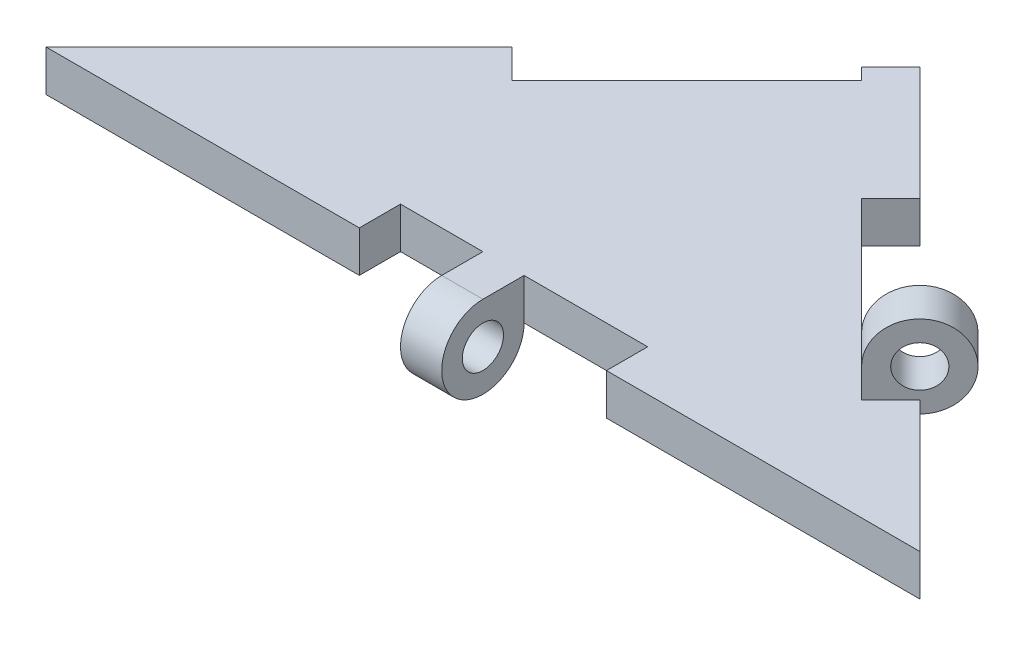
ISO-10303-21;
HEADER;
FILE_DESCRIPTION(('STEP AP214'),'2;1');
FILE_NAME('part.step','',(''),(''),'','','');
FILE_SCHEMA(('AUTOMOTIVE_DESIGN { 1 0 10303 214 1 1 1 1 }'));
ENDSEC;
DATA;
#1=APPLICATION_CONTEXT('core data for automotive mechanical design processes');
#2=APPLICATION_PROTOCOL_DEFINITION('international standard','automotive_design',2000,#1);
#3=PRODUCT_CONTEXT('',#1,'mechanical');
#4=PRODUCT('Part','Part','',(#3));
#5=PRODUCT_RELATED_PRODUCT_CATEGORY('part','',(#4));
#6=PRODUCT_DEFINITION_FORMATION('','',#4);
#7=PRODUCT_DEFINITION_CONTEXT('part definition',#1,'design');
#8=PRODUCT_DEFINITION('design','',#6,#7);
#9=PRODUCT_DEFINITION_SHAPE('','',#8);
#10=(LENGTH_UNIT() NAMED_UNIT(*) SI_UNIT(.MILLI.,.METRE.));
#11=(NAMED_UNIT(*) PLANE_ANGLE_UNIT() SI_UNIT($,.RADIAN.));
#12=(NAMED_UNIT(*) SI_UNIT($,.STERADIAN.) SOLID_ANGLE_UNIT());
#13=UNCERTAINTY_MEASURE_WITH_UNIT(LENGTH_MEASURE(1.E-05),#10,'distance_accuracy_value','');
#14=(GEOMETRIC_REPRESENTATION_CONTEXT(3) GLOBAL_UNCERTAINTY_ASSIGNED_CONTEXT((#13)) GLOBAL_UNIT_ASSIGNED_CONTEXT((#10,
#11,#12)) REPRESENTATION_CONTEXT('',''));
#15=CARTESIAN_POINT('',(0.,0.,0.));
#16=DIRECTION('',(0.,0.,1.));
#17=DIRECTION('',(1.,0.,0.));
#18=AXIS2_PLACEMENT_3D('',#15,#16,#17);
#19=CARTESIAN_POINT('',(12.3743686707646,5.,-33.587572106361));
#20=DIRECTION('',(-0.707106781186548,0.,0.707106781186547));
#21=DIRECTION('',(0.707106781186547,0.,0.707106781186548));
#22=AXIS2_PLACEMENT_3D('',#19,#20,#21);
#23=PLANE('',#22);
#24=DIRECTION('',(0.,1.,0.));
#25=VECTOR('',#24,1.);
#26=CARTESIAN_POINT('',(30.0520382004283,0.,-15.9099025766973));
#27=LINE('',#26,#25);
#28=CARTESIAN_POINT('',(30.0520382004283,0.,-15.9099025766973));
#29=VERTEX_POINT('',#28);
#30=CARTESIAN_POINT('',(30.0520382004283,5.,-15.9099025766973));
#31=VERTEX_POINT('',#30);
#32=EDGE_CURVE('E333',#29,#31,#27,.T.);
#33=ORIENTED_EDGE('',*,*,#32,.T.);
#34=DIRECTION('',(-0.707106781186547,0.,-0.707106781186548));
#35=VECTOR('',#34,1.);
#36=CARTESIAN_POINT('',(12.3743686707646,5.,-33.587572106361));
#37=LINE('',#36,#35);
#38=CARTESIAN_POINT('',(33.587572106361,5.,-12.3743686707646));
#39=VERTEX_POINT('',#38);
#40=EDGE_CURVE('E292',#39,#31,#37,.T.);
#41=ORIENTED_EDGE('',*,*,#40,.F.);
#42=DIRECTION('',(0.,-1.,0.));
#43=VECTOR('',#42,1.);
#44=CARTESIAN_POINT('',(33.587572106361,5.,-12.3743686707646));
#45=LINE('',#44,#43);
#46=CARTESIAN_POINT('',(33.587572106361,0.,-12.3743686707646));
#47=VERTEX_POINT('',#46);
#48=EDGE_CURVE('E287',#39,#47,#45,.T.);
#49=ORIENTED_EDGE('',*,*,#48,.T.);
#50=DIRECTION('',(-0.707106781186547,0.,-0.707106781186548));
#51=VECTOR('',#50,1.);
#52=CARTESIAN_POINT('',(12.3743686707646,0.,-33.587572106361));
#53=LINE('',#52,#51);
#54=EDGE_CURVE('E386',#47,#29,#53,.T.);
#55=ORIENTED_EDGE('',*,*,#54,.T.);
#56=EDGE_LOOP('',(#33,#41,#49,#55));
#57=FACE_BOUND('',#56,.T.);
#58=ADVANCED_FACE('F36',(#57),#23,.F.);
#59=CARTESIAN_POINT('',(-15.,0.,-5.00000000000001));
#60=DIRECTION('',(0.,0.,-1.));
#61=DIRECTION('',(-1.,0.,0.));
#62=AXIS2_PLACEMENT_3D('',#59,#60,#61);
#63=PLANE('',#62);
#64=DIRECTION('',(0.,-1.,0.));
#65=VECTOR('',#64,1.);
#66=CARTESIAN_POINT('',(0.,0.,-5.));
#67=LINE('',#66,#65);
#68=CARTESIAN_POINT('',(0.,5.,-5.));
#69=VERTEX_POINT('',#68);
#70=CARTESIAN_POINT('',(0.,0.,-5.00000000000001));
#71=VERTEX_POINT('',#70);
#72=EDGE_CURVE('E374',#69,#71,#67,.T.);
#73=ORIENTED_EDGE('',*,*,#72,.T.);
#74=DIRECTION('',(-1.,0.,0.));
#75=VECTOR('',#74,1.);
#76=CARTESIAN_POINT('',(-15.,0.,-5.00000000000001));
#77=LINE('',#76,#75);
#78=CARTESIAN_POINT('',(15.,0.,-5.00000000000001));
#79=VERTEX_POINT('',#78);
#80=EDGE_CURVE('E253',#79,#71,#77,.T.);
#81=ORIENTED_EDGE('',*,*,#80,.F.);
#82=DIRECTION('',(0.,1.,0.));
#83=VECTOR('',#82,1.);
#84=CARTESIAN_POINT('',(15.,0.,-5.00000000000001));
#85=LINE('',#84,#83);
#86=CARTESIAN_POINT('',(15.,5.,-5.00000000000001));
#87=VERTEX_POINT('',#86);
#88=EDGE_CURVE('E264',#79,#87,#85,.T.);
#89=ORIENTED_EDGE('',*,*,#88,.T.);
#90=DIRECTION('',(-1.,0.,0.));
#91=VECTOR('',#90,1.);
#92=CARTESIAN_POINT('',(-15.,5.,-5.00000000000001));
#93=LINE('',#92,#91);
#94=EDGE_CURVE('E244',#87,#69,#93,.T.);
#95=ORIENTED_EDGE('',*,*,#94,.T.);
#96=EDGE_LOOP('',(#73,#81,#89,#95));
#97=FACE_BOUND('',#96,.T.);
#98=ADVANCED_FACE('F416',(#97),#63,.F.);
#99=CARTESIAN_POINT('',(0.,5.,-53.0330085889911));
#100=DIRECTION('',(-0.707106781186548,0.,0.707106781186547));
#101=DIRECTION('',(0.707106781186547,0.,0.707106781186548));
#102=AXIS2_PLACEMENT_3D('',#99,#100,#101);
#103=PLANE('',#102);
#104=DIRECTION('',(-0.707106781186547,0.,-0.707106781186548));
#105=VECTOR('',#104,1.);
#106=CARTESIAN_POINT('',(0.,0.,-53.0330085889911));
#107=LINE('',#106,#105);
#108=CARTESIAN_POINT('',(15.9099025766973,0.,-37.1231060122938));
#109=VERTEX_POINT('',#108);
#110=CARTESIAN_POINT('',(2.12132034355964,0.,-50.9116882454314));
#111=VERTEX_POINT('',#110);
#112=EDGE_CURVE('E192',#109,#111,#107,.T.);
#113=ORIENTED_EDGE('',*,*,#112,.T.);
#114=DIRECTION('',(0.,1.,0.));
#115=VECTOR('',#114,1.);
#116=CARTESIAN_POINT('',(2.12132034355964,-5.,-50.9116882454314));
#117=LINE('',#116,#115);
#118=CARTESIAN_POINT('',(2.12132034355964,5.,-50.9116882454314));
#119=VERTEX_POINT('',#118);
#120=EDGE_CURVE('E179',#111,#119,#117,.T.);
#121=ORIENTED_EDGE('',*,*,#120,.T.);
#122=DIRECTION('',(-0.707106781186547,0.,-0.707106781186548));
#123=VECTOR('',#122,1.);
#124=CARTESIAN_POINT('',(0.,5.,-53.0330085889911));
#125=LINE('',#124,#123);
#126=CARTESIAN_POINT('',(15.9099025766973,5.,-37.1231060122938));
#127=VERTEX_POINT('',#126);
#128=EDGE_CURVE('E190',#127,#119,#125,.T.);
#129=ORIENTED_EDGE('',*,*,#128,.F.);
#130=DIRECTION('',(0.,-1.,0.));
#131=VECTOR('',#130,1.);
#132=CARTESIAN_POINT('',(15.9099025766973,5.,-37.1231060122938));
#133=LINE('',#132,#131);
#134=EDGE_CURVE('E288',#127,#109,#133,.T.);
#135=ORIENTED_EDGE('',*,*,#134,.T.);
#136=EDGE_LOOP('',(#113,#121,#129,#135));
#137=FACE_BOUND('',#136,.T.);
#138=ADVANCED_FACE('F188',(#137),#103,.F.);
#139=CARTESIAN_POINT('',(-53.0330085889911,5.,0.));
#140=DIRECTION('',(0.,0.,-1.));
#141=DIRECTION('',(-1.,0.,0.));
#142=AXIS2_PLACEMENT_3D('',#139,#140,#141);
#143=PLANE('',#142);
#144=DIRECTION('',(1.,0.,0.));
#145=VECTOR('',#144,1.);
#146=CARTESIAN_POINT('',(-53.0330085889911,0.,0.));
#147=LINE('',#146,#145);
#148=CARTESIAN_POINT('',(-53.0330085889911,0.,0.));
#149=VERTEX_POINT('',#148);
#150=CARTESIAN_POINT('',(-15.,0.,0.));
#151=VERTEX_POINT('',#150);
#152=EDGE_CURVE('E212',#149,#151,#147,.T.);
#153=ORIENTED_EDGE('',*,*,#152,.T.);
#154=DIRECTION('',(0.,1.,0.));
#155=VECTOR('',#154,1.);
#156=CARTESIAN_POINT('',(-15.,0.,0.));
#157=LINE('',#156,#155);
#158=CARTESIAN_POINT('',(-15.,5.,0.));
#159=VERTEX_POINT('',#158);
#160=EDGE_CURVE('E256',#151,#159,#157,.T.);
#161=ORIENTED_EDGE('',*,*,#160,.T.);
#162=DIRECTION('',(1.,0.,0.));
#163=VECTOR('',#162,1.);
#164=CARTESIAN_POINT('',(-53.0330085889911,5.,0.));
#165=LINE('',#164,#163);
#166=CARTESIAN_POINT('',(-53.0330085889911,5.,0.));
#167=VERTEX_POINT('',#166);
#168=EDGE_CURVE('E199',#167,#159,#165,.T.);
#169=ORIENTED_EDGE('',*,*,#168,.F.);
#170=DIRECTION('',(0.,-1.,0.));
#171=VECTOR('',#170,1.);
#172=CARTESIAN_POINT('',(-53.0330085889911,5.,0.));
#173=LINE('',#172,#171);
#174=EDGE_CURVE('E44',#167,#149,#173,.T.);
#175=ORIENTED_EDGE('',*,*,#174,.T.);
#176=EDGE_LOOP('',(#153,#161,#169,#175));
#177=FACE_BOUND('',#176,.T.);
#178=ADVANCED_FACE('F224',(#177),#143,.F.);
#179=CARTESIAN_POINT('',(-53.0330085889911,5.,0.));
#180=DIRECTION('',(0.707106781186548,0.,0.707106781186547));
#181=DIRECTION('',(0.707106781186547,0.,-0.707106781186548));
#182=AXIS2_PLACEMENT_3D('',#179,#180,#181);
#183=PLANE('',#182);
#184=DIRECTION('',(-0.707106781186547,0.,0.707106781186548));
#185=VECTOR('',#184,1.);
#186=CARTESIAN_POINT('',(-53.0330085889911,5.,0.));
#187=LINE('',#186,#185);
#188=CARTESIAN_POINT('',(-24.7487373415292,5.,-28.2842712474619));
#189=VERTEX_POINT('',#188);
#190=EDGE_CURVE('E218',#189,#167,#187,.T.);
#191=ORIENTED_EDGE('',*,*,#190,.F.);
#192=DIRECTION('',(0.,1.,0.));
#193=VECTOR('',#192,1.);
#194=CARTESIAN_POINT('',(-24.7487373415292,0.,-28.2842712474619));
#195=LINE('',#194,#193);
#196=CARTESIAN_POINT('',(-24.7487373415292,0.,-28.2842712474619));
#197=VERTEX_POINT('',#196);
#198=EDGE_CURVE('E231',#197,#189,#195,.T.);
#199=ORIENTED_EDGE('',*,*,#198,.F.);
#200=DIRECTION('',(-0.707106781186547,0.,0.707106781186548));
#201=VECTOR('',#200,1.);
#202=CARTESIAN_POINT('',(-53.0330085889911,0.,0.));
#203=LINE('',#202,#201);
#204=EDGE_CURVE('E208',#197,#149,#203,.T.);
#205=ORIENTED_EDGE('',*,*,#204,.T.);
#206=ORIENTED_EDGE('',*,*,#174,.F.);
#207=EDGE_LOOP('',(#191,#199,#205,#206));
#208=FACE_BOUND('',#207,.T.);
#209=ADVANCED_FACE('F38',(#208),#183,.F.);
#210=CARTESIAN_POINT('',(15.,5.,0.));
#211=VERTEX_POINT('',#210);
#212=CARTESIAN_POINT('',(53.0330085889911,5.,0.));
#213=VERTEX_POINT('',#212);
#214=EDGE_CURVE('E204',#211,#213,#165,.T.);
#215=ORIENTED_EDGE('',*,*,#214,.F.);
#216=DIRECTION('',(0.,1.,0.));
#217=VECTOR('',#216,1.);
#218=CARTESIAN_POINT('',(15.,0.,0.));
#219=LINE('',#218,#217);
#220=CARTESIAN_POINT('',(15.,0.,0.));
#221=VERTEX_POINT('',#220);
#222=EDGE_CURVE('E266',#221,#211,#219,.T.);
#223=ORIENTED_EDGE('',*,*,#222,.F.);
#224=CARTESIAN_POINT('',(53.0330085889911,0.,0.));
#225=VERTEX_POINT('',#224);
#226=EDGE_CURVE('E210',#221,#225,#147,.T.);
#227=ORIENTED_EDGE('',*,*,#226,.T.);
#228=DIRECTION('',(0.,-1.,0.));
#229=VECTOR('',#228,1.);
#230=CARTESIAN_POINT('',(53.0330085889911,5.,0.));
#231=LINE('',#230,#229);
#232=EDGE_CURVE('E202',#213,#225,#231,.T.);
#233=ORIENTED_EDGE('',*,*,#232,.F.);
#234=EDGE_LOOP('',(#215,#223,#227,#233));
#235=FACE_BOUND('',#234,.T.);
#236=ADVANCED_FACE('F277',(#235),#143,.F.);
#237=CARTESIAN_POINT('',(37.1231060122937,0.,-15.9099025766973));
#238=VERTEX_POINT('',#237);
#239=EDGE_CURVE('E215',#225,#238,#107,.T.);
#240=ORIENTED_EDGE('',*,*,#239,.T.);
#241=DIRECTION('',(0.,-1.,0.));
#242=VECTOR('',#241,1.);
#243=CARTESIAN_POINT('',(37.1231060122937,5.,-15.9099025766973));
#244=LINE('',#243,#242);
#245=CARTESIAN_POINT('',(37.1231060122937,5.,-15.9099025766973));
#246=VERTEX_POINT('',#245);
#247=EDGE_CURVE('E283',#246,#238,#244,.T.);
#248=ORIENTED_EDGE('',*,*,#247,.F.);
#249=EDGE_CURVE('E198',#213,#246,#125,.T.);
#250=ORIENTED_EDGE('',*,*,#249,.F.);
#251=ORIENTED_EDGE('',*,*,#232,.T.);
#252=EDGE_LOOP('',(#240,#248,#250,#251));
#253=FACE_BOUND('',#252,.T.);
#254=ADVANCED_FACE('F282',(#253),#103,.F.);
#255=CARTESIAN_POINT('',(0.,5.,0.));
#256=DIRECTION('',(0.,-1.,0.));
#257=DIRECTION('',(0.,0.,-1.));
#258=AXIS2_PLACEMENT_3D('',#255,#256,#257);
#259=PLANE('',#258);
#260=ORIENTED_EDGE('',*,*,#128,.T.);
#261=DIRECTION('',(0.707106781186547,0.,-0.707106781186548));
#262=VECTOR('',#261,1.);
#263=CARTESIAN_POINT('',(2.12132034355964,5.,-50.9116882454314));
#264=LINE('',#263,#262);
#265=CARTESIAN_POINT('',(-1.41421356237311,5.,-47.3761543394987));
#266=VERTEX_POINT('',#265);
#267=EDGE_CURVE('E176',#266,#119,#264,.T.);
#268=ORIENTED_EDGE('',*,*,#267,.F.);
#269=DIRECTION('',(-0.707106781186549,0.,-0.707106781186546));
#270=VECTOR('',#269,1.);
#271=CARTESIAN_POINT('',(-3.53553390593275,5.,-49.4974746830583));
#272=LINE('',#271,#270);
#273=CARTESIAN_POINT('',(0.,5.,-45.9619407771256));
#274=VERTEX_POINT('',#273);
#275=EDGE_CURVE('E305',#274,#266,#272,.T.);
#276=ORIENTED_EDGE('',*,*,#275,.F.);
#277=DIRECTION('',(0.707106781186548,0.,-0.707106781186547));
#278=VECTOR('',#277,1.);
#279=CARTESIAN_POINT('',(0.,5.,-45.9619407771256));
#280=LINE('',#279,#278);
#281=CARTESIAN_POINT('',(-21.2132034355964,5.,-24.7487373415292));
#282=VERTEX_POINT('',#281);
#283=EDGE_CURVE('E300',#282,#274,#280,.T.);
#284=ORIENTED_EDGE('',*,*,#283,.F.);
#285=DIRECTION('',(0.707106781186548,0.,0.707106781186546));
#286=VECTOR('',#285,1.);
#287=CARTESIAN_POINT('',(-24.7487373415292,5.,-28.2842712474619));
#288=LINE('',#287,#286);
#289=EDGE_CURVE('E307',#189,#282,#288,.T.);
#290=ORIENTED_EDGE('',*,*,#289,.F.);
#291=ORIENTED_EDGE('',*,*,#190,.T.);
#292=ORIENTED_EDGE('',*,*,#168,.T.);
#293=DIRECTION('',(0.,0.,1.));
#294=VECTOR('',#293,1.);
#295=CARTESIAN_POINT('',(-15.,5.,0.));
#296=LINE('',#295,#294);
#297=CARTESIAN_POINT('',(-15.,5.,-5.00000000000001));
#298=VERTEX_POINT('',#297);
#299=EDGE_CURVE('E257',#298,#159,#296,.T.);
#300=ORIENTED_EDGE('',*,*,#299,.F.);
#301=CARTESIAN_POINT('',(-5.,5.,-5.00000000000001));
#302=VERTEX_POINT('',#301);
#303=EDGE_CURVE('E248',#302,#298,#93,.T.);
#304=ORIENTED_EDGE('',*,*,#303,.F.);
#305=DIRECTION('',(0.,0.,-1.));
#306=VECTOR('',#305,1.);
#307=CARTESIAN_POINT('',(-5.,5.,0.));
#308=LINE('',#307,#306);
#309=CARTESIAN_POINT('',(-5.,5.,0.));
#310=VERTEX_POINT('',#309);
#311=EDGE_CURVE('E358',#310,#302,#308,.T.);
#312=ORIENTED_EDGE('',*,*,#311,.F.);
#313=DIRECTION('',(1.,0.,0.));
#314=VECTOR('',#313,1.);
#315=CARTESIAN_POINT('',(-5.,5.,0.));
#316=LINE('',#315,#314);
#317=CARTESIAN_POINT('',(0.,5.,0.));
#318=VERTEX_POINT('',#317);
#319=EDGE_CURVE('E380',#310,#318,#316,.T.);
#320=ORIENTED_EDGE('',*,*,#319,.T.);
#321=DIRECTION('',(0.,0.,-1.));
#322=VECTOR('',#321,1.);
#323=CARTESIAN_POINT('',(0.,5.,0.));
#324=LINE('',#323,#322);
#325=EDGE_CURVE('E371',#318,#69,#324,.T.);
#326=ORIENTED_EDGE('',*,*,#325,.T.);
#327=ORIENTED_EDGE('',*,*,#94,.F.);
#328=DIRECTION('',(0.,0.,-1.));
#329=VECTOR('',#328,1.);
#330=CARTESIAN_POINT('',(15.,5.,0.));
#331=LINE('',#330,#329);
#332=EDGE_CURVE('E259',#211,#87,#331,.T.);
#333=ORIENTED_EDGE('',*,*,#332,.F.);
#334=ORIENTED_EDGE('',*,*,#214,.T.);
#335=ORIENTED_EDGE('',*,*,#249,.T.);
#336=DIRECTION('',(-0.707106781186547,0.,0.707106781186548));
#337=VECTOR('',#336,1.);
#338=CARTESIAN_POINT('',(37.1231060122937,5.,-15.9099025766973));
#339=LINE('',#338,#337);
#340=EDGE_CURVE('E385',#246,#39,#339,.T.);
#341=ORIENTED_EDGE('',*,*,#340,.T.);
#342=ORIENTED_EDGE('',*,*,#40,.T.);
#343=DIRECTION('',(0.707106781186547,0.,0.707106781186548));
#344=VECTOR('',#343,1.);
#345=CARTESIAN_POINT('',(26.5165042944956,5.,-19.44543648263));
#346=LINE('',#345,#344);
#347=CARTESIAN_POINT('',(26.5165042944955,5.,-19.4454364826301));
#348=VERTEX_POINT('',#347);
#349=EDGE_CURVE('E341',#348,#31,#346,.T.);
#350=ORIENTED_EDGE('',*,*,#349,.F.);
#351=CARTESIAN_POINT('',(12.3743686707646,5.,-33.587572106361));
#352=VERTEX_POINT('',#351);
#353=EDGE_CURVE('E58',#348,#352,#37,.T.);
#354=ORIENTED_EDGE('',*,*,#353,.T.);
#355=DIRECTION('',(0.707106781186548,0.,-0.707106781186547));
#356=VECTOR('',#355,1.);
#357=CARTESIAN_POINT('',(15.9099025766973,5.,-37.1231060122938));
#358=LINE('',#357,#356);
#359=EDGE_CURVE('E197',#352,#127,#358,.T.);
#360=ORIENTED_EDGE('',*,*,#359,.T.);
#361=EDGE_LOOP('',(#260,#268,#276,#284,#290,#291,#292,#300,#304,#312,#320,#326,#327,#333,#334,
#335,#341,#342,#350,#354,#360));
#362=FACE_BOUND('',#361,.T.);
#363=ADVANCED_FACE('F195',(#362),#259,.F.);
#364=CARTESIAN_POINT('',(0.,0.,0.));
#365=DIRECTION('',(0.,-1.,0.));
#366=DIRECTION('',(0.,0.,-1.));
#367=AXIS2_PLACEMENT_3D('',#364,#365,#366);
#368=PLANE('',#367);
#369=DIRECTION('',(-0.707106781186547,0.,0.707106781186548));
#370=VECTOR('',#369,1.);
#371=CARTESIAN_POINT('',(-24.3951839509359,0.,-24.3951839509359));
#372=LINE('',#371,#370);
#373=CARTESIAN_POINT('',(-1.41421356237311,0.,-47.3761543394987));
#374=VERTEX_POINT('',#373);
#375=EDGE_CURVE('E51',#111,#374,#372,.T.);
#376=ORIENTED_EDGE('',*,*,#375,.F.);
#377=ORIENTED_EDGE('',*,*,#112,.F.);
#378=DIRECTION('',(0.707106781186548,0.,-0.707106781186547));
#379=VECTOR('',#378,1.);
#380=CARTESIAN_POINT('',(15.9099025766973,0.,-37.1231060122938));
#381=LINE('',#380,#379);
#382=CARTESIAN_POINT('',(12.3743686707646,0.,-33.587572106361));
#383=VERTEX_POINT('',#382);
#384=EDGE_CURVE('E383',#383,#109,#381,.T.);
#385=ORIENTED_EDGE('',*,*,#384,.F.);
#386=CARTESIAN_POINT('',(26.5165042944955,0.,-19.4454364826301));
#387=VERTEX_POINT('',#386);
#388=EDGE_CURVE('E393',#387,#383,#53,.T.);
#389=ORIENTED_EDGE('',*,*,#388,.F.);
#390=DIRECTION('',(-0.707106781186548,0.,0.707106781186547));
#391=VECTOR('',#390,1.);
#392=CARTESIAN_POINT('',(3.53553390593274,0.,3.53553390593274));
#393=LINE('',#392,#391);
#394=CARTESIAN_POINT('',(30.0520382004283,0.,-22.9809703885628));
#395=VERTEX_POINT('',#394);
#396=EDGE_CURVE('E336',#395,#387,#393,.T.);
#397=ORIENTED_EDGE('',*,*,#396,.F.);
#398=DIRECTION('',(0.707106781186547,0.,0.707106781186548));
#399=VECTOR('',#398,1.);
#400=CARTESIAN_POINT('',(30.0520382004283,0.,-22.9809703885628));
#401=LINE('',#400,#399);
#402=CARTESIAN_POINT('',(33.587572106361,0.,-19.4454364826301));
#403=VERTEX_POINT('',#402);
#404=EDGE_CURVE('E351',#395,#403,#401,.T.);
#405=ORIENTED_EDGE('',*,*,#404,.T.);
#406=DIRECTION('',(-0.707106781186548,0.,0.707106781186547));
#407=VECTOR('',#406,1.);
#408=CARTESIAN_POINT('',(7.07106781186548,0.,7.07106781186548));
#409=LINE('',#408,#407);
#410=EDGE_CURVE('E345',#403,#29,#409,.T.);
#411=ORIENTED_EDGE('',*,*,#410,.T.);
#412=ORIENTED_EDGE('',*,*,#54,.F.);
#413=DIRECTION('',(-0.707106781186547,0.,0.707106781186548));
#414=VECTOR('',#413,1.);
#415=CARTESIAN_POINT('',(37.1231060122937,0.,-15.9099025766973));
#416=LINE('',#415,#414);
#417=EDGE_CURVE('E391',#238,#47,#416,.T.);
#418=ORIENTED_EDGE('',*,*,#417,.F.);
#419=ORIENTED_EDGE('',*,*,#239,.F.);
#420=ORIENTED_EDGE('',*,*,#226,.F.);
#421=DIRECTION('',(0.,0.,-1.));
#422=VECTOR('',#421,1.);
#423=CARTESIAN_POINT('',(15.,0.,0.));
#424=LINE('',#423,#422);
#425=EDGE_CURVE('E243',#221,#79,#424,.T.);
#426=ORIENTED_EDGE('',*,*,#425,.T.);
#427=ORIENTED_EDGE('',*,*,#80,.T.);
#428=DIRECTION('',(1.,0.,0.));
#429=VECTOR('',#428,1.);
#430=CARTESIAN_POINT('',(-5.,0.,-5.));
#431=LINE('',#430,#429);
#432=CARTESIAN_POINT('',(-5.,0.,-5.00000000000001));
#433=VERTEX_POINT('',#432);
#434=EDGE_CURVE('E368',#433,#71,#431,.T.);
#435=ORIENTED_EDGE('',*,*,#434,.F.);
#436=CARTESIAN_POINT('',(-15.,0.,-5.00000000000001));
#437=VERTEX_POINT('',#436);
#438=EDGE_CURVE('E239',#433,#437,#77,.T.);
#439=ORIENTED_EDGE('',*,*,#438,.T.);
#440=DIRECTION('',(0.,0.,1.));
#441=VECTOR('',#440,1.);
#442=CARTESIAN_POINT('',(-15.,0.,0.));
#443=LINE('',#442,#441);
#444=EDGE_CURVE('E237',#437,#151,#443,.T.);
#445=ORIENTED_EDGE('',*,*,#444,.T.);
#446=ORIENTED_EDGE('',*,*,#152,.F.);
#447=ORIENTED_EDGE('',*,*,#204,.F.);
#448=DIRECTION('',(0.707106781186548,0.,0.707106781186546));
#449=VECTOR('',#448,1.);
#450=CARTESIAN_POINT('',(-24.7487373415292,0.,-28.2842712474619));
#451=LINE('',#450,#449);
#452=CARTESIAN_POINT('',(-21.2132034355964,0.,-24.7487373415292));
#453=VERTEX_POINT('',#452);
#454=EDGE_CURVE('E299',#197,#453,#451,.T.);
#455=ORIENTED_EDGE('',*,*,#454,.T.);
#456=DIRECTION('',(0.707106781186548,0.,-0.707106781186547));
#457=VECTOR('',#456,1.);
#458=CARTESIAN_POINT('',(0.,0.,-45.9619407771256));
#459=LINE('',#458,#457);
#460=CARTESIAN_POINT('',(0.,0.,-45.9619407771256));
#461=VERTEX_POINT('',#460);
#462=EDGE_CURVE('E302',#453,#461,#459,.T.);
#463=ORIENTED_EDGE('',*,*,#462,.T.);
#464=DIRECTION('',(-0.707106781186549,0.,-0.707106781186546));
#465=VECTOR('',#464,1.);
#466=CARTESIAN_POINT('',(-3.53553390593275,0.,-49.4974746830583));
#467=LINE('',#466,#465);
#468=EDGE_CURVE('E296',#461,#374,#467,.T.);
#469=ORIENTED_EDGE('',*,*,#468,.T.);
#470=EDGE_LOOP('',(#376,#377,#385,#389,#397,#405,#411,#412,#418,#419,#420,#426,#427,#435,#439,
#445,#446,#447,#455,#463,#469));
#471=FACE_BOUND('',#470,.T.);
#472=ADVANCED_FACE('F235',(#471),#368,.T.);
#473=CARTESIAN_POINT('',(-15.,0.,0.));
#474=DIRECTION('',(-1.,0.,0.));
#475=DIRECTION('',(0.,0.,1.));
#476=AXIS2_PLACEMENT_3D('',#473,#474,#475);
#477=PLANE('',#476);
#478=ORIENTED_EDGE('',*,*,#299,.T.);
#479=ORIENTED_EDGE('',*,*,#160,.F.);
#480=ORIENTED_EDGE('',*,*,#444,.F.);
#481=DIRECTION('',(0.,1.,0.));
#482=VECTOR('',#481,1.);
#483=CARTESIAN_POINT('',(-15.,0.,-5.00000000000001));
#484=LINE('',#483,#482);
#485=EDGE_CURVE('E211',#437,#298,#484,.T.);
#486=ORIENTED_EDGE('',*,*,#485,.T.);
#487=EDGE_LOOP('',(#478,#479,#480,#486));
#488=FACE_BOUND('',#487,.T.);
#489=ADVANCED_FACE('F433',(#488),#477,.F.);
#490=ORIENTED_EDGE('',*,*,#438,.F.);
#491=DIRECTION('',(0.,-1.,0.));
#492=VECTOR('',#491,1.);
#493=CARTESIAN_POINT('',(-5.,0.,-5.));
#494=LINE('',#493,#492);
#495=EDGE_CURVE('E362',#302,#433,#494,.T.);
#496=ORIENTED_EDGE('',*,*,#495,.F.);
#497=ORIENTED_EDGE('',*,*,#303,.T.);
#498=ORIENTED_EDGE('',*,*,#485,.F.);
#499=EDGE_LOOP('',(#490,#496,#497,#498));
#500=FACE_BOUND('',#499,.T.);
#501=ADVANCED_FACE('F431',(#500),#63,.F.);
#502=CARTESIAN_POINT('',(15.,0.,0.));
#503=DIRECTION('',(1.,0.,0.));
#504=DIRECTION('',(0.,0.,-1.));
#505=AXIS2_PLACEMENT_3D('',#502,#503,#504);
#506=PLANE('',#505);
#507=ORIENTED_EDGE('',*,*,#332,.T.);
#508=ORIENTED_EDGE('',*,*,#88,.F.);
#509=ORIENTED_EDGE('',*,*,#425,.F.);
#510=ORIENTED_EDGE('',*,*,#222,.T.);
#511=EDGE_LOOP('',(#507,#508,#509,#510));
#512=FACE_BOUND('',#511,.T.);
#513=ADVANCED_FACE('F414',(#512),#506,.F.);
#514=CARTESIAN_POINT('',(-3.53553390593275,0.,-49.4974746830583));
#515=DIRECTION('',(0.707106781186546,0.,-0.707106781186549));
#516=DIRECTION('',(-0.707106781186549,0.,-0.707106781186546));
#517=AXIS2_PLACEMENT_3D('',#514,#515,#516);
#518=PLANE('',#517);
#519=ORIENTED_EDGE('',*,*,#275,.T.);
#520=DIRECTION('',(0.,-1.,0.));
#521=VECTOR('',#520,1.);
#522=CARTESIAN_POINT('',(-1.41421356237311,0.,-47.3761543394987));
#523=LINE('',#522,#521);
#524=EDGE_CURVE('E11',#266,#374,#523,.T.);
#525=ORIENTED_EDGE('',*,*,#524,.T.);
#526=ORIENTED_EDGE('',*,*,#468,.F.);
#527=DIRECTION('',(0.,1.,0.));
#528=VECTOR('',#527,1.);
#529=CARTESIAN_POINT('',(0.,0.,-45.9619407771256));
#530=LINE('',#529,#528);
#531=EDGE_CURVE('E260',#461,#274,#530,.T.);
#532=ORIENTED_EDGE('',*,*,#531,.T.);
#533=EDGE_LOOP('',(#519,#525,#526,#532));
#534=FACE_BOUND('',#533,.T.);
#535=ADVANCED_FACE('F321',(#534),#518,.F.);
#536=CARTESIAN_POINT('',(0.,0.,-45.9619407771256));
#537=DIRECTION('',(0.707106781186547,0.,0.707106781186548));
#538=DIRECTION('',(0.707106781186548,0.,-0.707106781186547));
#539=AXIS2_PLACEMENT_3D('',#536,#537,#538);
#540=PLANE('',#539);
#541=ORIENTED_EDGE('',*,*,#283,.T.);
#542=ORIENTED_EDGE('',*,*,#531,.F.);
#543=ORIENTED_EDGE('',*,*,#462,.F.);
#544=DIRECTION('',(0.,1.,0.));
#545=VECTOR('',#544,1.);
#546=CARTESIAN_POINT('',(-21.2132034355964,0.,-24.7487373415292));
#547=LINE('',#546,#545);
#548=EDGE_CURVE('E312',#453,#282,#547,.T.);
#549=ORIENTED_EDGE('',*,*,#548,.T.);
#550=EDGE_LOOP('',(#541,#542,#543,#549));
#551=FACE_BOUND('',#550,.T.);
#552=ADVANCED_FACE('F318',(#551),#540,.F.);
#553=CARTESIAN_POINT('',(-24.7487373415292,0.,-28.2842712474619));
#554=DIRECTION('',(-0.707106781186546,0.,0.707106781186549));
#555=DIRECTION('',(0.707106781186549,0.,0.707106781186546));
#556=AXIS2_PLACEMENT_3D('',#553,#554,#555);
#557=PLANE('',#556);
#558=ORIENTED_EDGE('',*,*,#289,.T.);
#559=ORIENTED_EDGE('',*,*,#548,.F.);
#560=ORIENTED_EDGE('',*,*,#454,.F.);
#561=ORIENTED_EDGE('',*,*,#198,.T.);
#562=EDGE_LOOP('',(#558,#559,#560,#561));
#563=FACE_BOUND('',#562,.T.);
#564=ADVANCED_FACE('F316',(#563),#557,.F.);
#565=CARTESIAN_POINT('',(15.9099025766973,5.,-37.1231060122938));
#566=DIRECTION('',(-0.707106781186547,0.,-0.707106781186548));
#567=DIRECTION('',(-0.707106781186548,0.,0.707106781186547));
#568=AXIS2_PLACEMENT_3D('',#565,#566,#567);
#569=PLANE('',#568);
#570=ORIENTED_EDGE('',*,*,#384,.T.);
#571=ORIENTED_EDGE('',*,*,#134,.F.);
#572=ORIENTED_EDGE('',*,*,#359,.F.);
#573=DIRECTION('',(0.,-1.,0.));
#574=VECTOR('',#573,1.);
#575=CARTESIAN_POINT('',(12.3743686707646,5.,-33.587572106361));
#576=LINE('',#575,#574);
#577=EDGE_CURVE('E290',#352,#383,#576,.T.);
#578=ORIENTED_EDGE('',*,*,#577,.T.);
#579=EDGE_LOOP('',(#570,#571,#572,#578));
#580=FACE_BOUND('',#579,.T.);
#581=ADVANCED_FACE('F396',(#580),#569,.F.);
#582=ORIENTED_EDGE('',*,*,#353,.F.);
#583=DIRECTION('',(0.,1.,0.));
#584=VECTOR('',#583,1.);
#585=CARTESIAN_POINT('',(26.5165042944956,0.,-19.44543648263));
#586=LINE('',#585,#584);
#587=EDGE_CURVE('E339',#387,#348,#586,.T.);
#588=ORIENTED_EDGE('',*,*,#587,.F.);
#589=ORIENTED_EDGE('',*,*,#388,.T.);
#590=ORIENTED_EDGE('',*,*,#577,.F.);
#591=EDGE_LOOP('',(#582,#588,#589,#590));
#592=FACE_BOUND('',#591,.T.);
#593=ADVANCED_FACE('F446',(#592),#23,.F.);
#594=CARTESIAN_POINT('',(37.1231060122937,5.,-15.9099025766973));
#595=DIRECTION('',(0.707106781186548,0.,0.707106781186547));
#596=DIRECTION('',(0.707106781186547,0.,-0.707106781186548));
#597=AXIS2_PLACEMENT_3D('',#594,#595,#596);
#598=PLANE('',#597);
#599=ORIENTED_EDGE('',*,*,#417,.T.);
#600=ORIENTED_EDGE('',*,*,#48,.F.);
#601=ORIENTED_EDGE('',*,*,#340,.F.);
#602=ORIENTED_EDGE('',*,*,#247,.T.);
#603=EDGE_LOOP('',(#599,#600,#601,#602));
#604=FACE_BOUND('',#603,.T.);
#605=ADVANCED_FACE('F411',(#604),#598,.F.);
#606=CARTESIAN_POINT('',(-5.,0.,0.));
#607=DIRECTION('',(1.,0.,0.));
#608=DIRECTION('',(0.,0.,-1.));
#609=AXIS2_PLACEMENT_3D('',#606,#607,#608);
#610=CYLINDRICAL_SURFACE('',#609,5.);
#611=CARTESIAN_POINT('',(0.,0.,0.));
#612=DIRECTION('',(-1.,0.,0.));
#613=DIRECTION('',(0.,0.,1.));
#614=AXIS2_PLACEMENT_3D('',#611,#612,#613);
#615=CIRCLE('',#614,5.);
#616=EDGE_CURVE('E354',#71,#318,#615,.T.);
#617=ORIENTED_EDGE('',*,*,#616,.T.);
#618=ORIENTED_EDGE('',*,*,#319,.F.);
#619=CARTESIAN_POINT('',(-5.,0.,0.));
#620=DIRECTION('',(-1.,0.,0.));
#621=DIRECTION('',(0.,0.,1.));
#622=AXIS2_PLACEMENT_3D('',#619,#620,#621);
#623=CIRCLE('',#622,5.);
#624=EDGE_CURVE('E355',#433,#310,#623,.T.);
#625=ORIENTED_EDGE('',*,*,#624,.F.);
#626=ORIENTED_EDGE('',*,*,#434,.T.);
#627=EDGE_LOOP('',(#617,#618,#625,#626));
#628=FACE_BOUND('',#627,.T.);
#629=ADVANCED_FACE('F424',(#628),#610,.T.);
#630=CARTESIAN_POINT('',(-5.,0.,0.));
#631=DIRECTION('',(1.,0.,0.));
#632=DIRECTION('',(0.,0.,-1.));
#633=AXIS2_PLACEMENT_3D('',#630,#631,#632);
#634=CYLINDRICAL_SURFACE('',#633,2.5);
#635=CARTESIAN_POINT('',(-5.,0.,0.));
#636=DIRECTION('',(-1.,0.,0.));
#637=DIRECTION('',(0.,0.,1.));
#638=AXIS2_PLACEMENT_3D('',#635,#636,#637);
#639=CIRCLE('',#638,2.5);
#640=CARTESIAN_POINT('',(-5.,0.,2.5));
#641=VERTEX_POINT('',#640);
#642=EDGE_CURVE('E365',#641,#641,#639,.T.);
#643=ORIENTED_EDGE('',*,*,#642,.T.);
#644=EDGE_LOOP('',(#643));
#645=FACE_BOUND('',#644,.T.);
#646=CARTESIAN_POINT('',(0.,0.,0.));
#647=DIRECTION('',(-1.,0.,0.));
#648=DIRECTION('',(0.,0.,1.));
#649=AXIS2_PLACEMENT_3D('',#646,#647,#648);
#650=CIRCLE('',#649,2.5);
#651=CARTESIAN_POINT('',(0.,0.,2.5));
#652=VERTEX_POINT('',#651);
#653=EDGE_CURVE('E359',#652,#652,#650,.T.);
#654=ORIENTED_EDGE('',*,*,#653,.F.);
#655=EDGE_LOOP('',(#654));
#656=FACE_BOUND('',#655,.T.);
#657=ADVANCED_FACE('F531',(#645,#656),#634,.F.);
#658=CARTESIAN_POINT('',(-5.,0.,0.));
#659=DIRECTION('',(-1.,0.,0.));
#660=DIRECTION('',(0.,0.,1.));
#661=AXIS2_PLACEMENT_3D('',#658,#659,#660);
#662=PLANE('',#661);
#663=ORIENTED_EDGE('',*,*,#624,.T.);
#664=ORIENTED_EDGE('',*,*,#311,.T.);
#665=ORIENTED_EDGE('',*,*,#495,.T.);
#666=EDGE_LOOP('',(#663,#664,#665));
#667=FACE_BOUND('',#666,.T.);
#668=ORIENTED_EDGE('',*,*,#642,.F.);
#669=EDGE_LOOP('',(#668));
#670=FACE_BOUND('',#669,.T.);
#671=ADVANCED_FACE('F427',(#667,#670),#662,.T.);
#672=CARTESIAN_POINT('',(0.,0.,0.));
#673=DIRECTION('',(-1.,0.,0.));
#674=DIRECTION('',(0.,0.,1.));
#675=AXIS2_PLACEMENT_3D('',#672,#673,#674);
#676=PLANE('',#675);
#677=ORIENTED_EDGE('',*,*,#616,.F.);
#678=ORIENTED_EDGE('',*,*,#72,.F.);
#679=ORIENTED_EDGE('',*,*,#325,.F.);
#680=EDGE_LOOP('',(#677,#678,#679));
#681=FACE_BOUND('',#680,.T.);
#682=ORIENTED_EDGE('',*,*,#653,.T.);
#683=EDGE_LOOP('',(#682));
#684=FACE_BOUND('',#683,.T.);
#685=ADVANCED_FACE('F420',(#681,#684),#676,.F.);
#686=CARTESIAN_POINT('',(30.0520382004283,5.,-22.9809703885628));
#687=DIRECTION('',(0.707106781186547,0.,0.707106781186548));
#688=DIRECTION('',(0.707106781186548,0.,-0.707106781186547));
#689=AXIS2_PLACEMENT_3D('',#686,#687,#688);
#690=CYLINDRICAL_SURFACE('',#689,5.);
#691=CARTESIAN_POINT('',(33.587572106361,5.,-19.4454364826301));
#692=DIRECTION('',(-0.707106781186547,0.,-0.707106781186548));
#693=DIRECTION('',(-0.707106781186548,0.,0.707106781186547));
#694=AXIS2_PLACEMENT_3D('',#691,#692,#693);
#695=CIRCLE('',#694,5.);
#696=EDGE_CURVE('E326',#31,#403,#695,.T.);
#697=ORIENTED_EDGE('',*,*,#696,.T.);
#698=ORIENTED_EDGE('',*,*,#404,.F.);
#699=CARTESIAN_POINT('',(30.0520382004283,5.,-22.9809703885628));
#700=DIRECTION('',(-0.707106781186547,0.,-0.707106781186548));
#701=DIRECTION('',(-0.707106781186548,0.,0.707106781186547));
#702=AXIS2_PLACEMENT_3D('',#699,#700,#701);
#703=CIRCLE('',#702,5.);
#704=EDGE_CURVE('E332',#348,#395,#703,.T.);
#705=ORIENTED_EDGE('',*,*,#704,.F.);
#706=ORIENTED_EDGE('',*,*,#349,.T.);
#707=EDGE_LOOP('',(#697,#698,#705,#706));
#708=FACE_BOUND('',#707,.T.);
#709=ADVANCED_FACE('F403',(#708),#690,.T.);
#710=CARTESIAN_POINT('',(30.0520382004283,5.,-22.9809703885628));
#711=DIRECTION('',(0.707106781186547,0.,0.707106781186548));
#712=DIRECTION('',(0.707106781186548,0.,-0.707106781186547));
#713=AXIS2_PLACEMENT_3D('',#710,#711,#712);
#714=CYLINDRICAL_SURFACE('',#713,2.50000000000001);
#715=CARTESIAN_POINT('',(30.0520382004283,5.,-22.9809703885628));
#716=DIRECTION('',(-0.707106781186547,0.,-0.707106781186548));
#717=DIRECTION('',(-0.707106781186548,0.,0.707106781186547));
#718=AXIS2_PLACEMENT_3D('',#715,#716,#717);
#719=CIRCLE('',#718,2.50000000000001);
#720=CARTESIAN_POINT('',(28.2842712474619,5.,-21.2132034355964));
#721=VERTEX_POINT('',#720);
#722=EDGE_CURVE('E329',#721,#721,#719,.T.);
#723=ORIENTED_EDGE('',*,*,#722,.T.);
#724=EDGE_LOOP('',(#723));
#725=FACE_BOUND('',#724,.T.);
#726=CARTESIAN_POINT('',(33.587572106361,5.,-19.4454364826301));
#727=DIRECTION('',(-0.707106781186547,0.,-0.707106781186548));
#728=DIRECTION('',(-0.707106781186548,0.,0.707106781186547));
#729=AXIS2_PLACEMENT_3D('',#726,#727,#728);
#730=CIRCLE('',#729,2.50000000000001);
#731=CARTESIAN_POINT('',(31.8198051533947,5.,-17.6776695296637));
#732=VERTEX_POINT('',#731);
#733=EDGE_CURVE('E323',#732,#732,#730,.T.);
#734=ORIENTED_EDGE('',*,*,#733,.F.);
#735=EDGE_LOOP('',(#734));
#736=FACE_BOUND('',#735,.T.);
#737=ADVANCED_FACE('F576',(#725,#736),#714,.F.);
#738=CARTESIAN_POINT('',(3.53553390593274,0.,3.53553390593274));
#739=DIRECTION('',(-0.707106781186547,0.,-0.707106781186548));
#740=DIRECTION('',(-0.707106781186548,0.,0.707106781186547));
#741=AXIS2_PLACEMENT_3D('',#738,#739,#740);
#742=PLANE('',#741);
#743=ORIENTED_EDGE('',*,*,#722,.F.);
#744=EDGE_LOOP('',(#743));
#745=FACE_BOUND('',#744,.T.);
#746=ORIENTED_EDGE('',*,*,#704,.T.);
#747=ORIENTED_EDGE('',*,*,#396,.T.);
#748=ORIENTED_EDGE('',*,*,#587,.T.);
#749=EDGE_LOOP('',(#746,#747,#748));
#750=FACE_BOUND('',#749,.T.);
#751=ADVANCED_FACE('F399',(#745,#750),#742,.T.);
#752=CARTESIAN_POINT('',(7.07106781186548,0.,7.07106781186548));
#753=DIRECTION('',(-0.707106781186547,0.,-0.707106781186548));
#754=DIRECTION('',(-0.707106781186548,0.,0.707106781186547));
#755=AXIS2_PLACEMENT_3D('',#752,#753,#754);
#756=PLANE('',#755);
#757=ORIENTED_EDGE('',*,*,#733,.T.);
#758=EDGE_LOOP('',(#757));
#759=FACE_BOUND('',#758,.T.);
#760=ORIENTED_EDGE('',*,*,#696,.F.);
#761=ORIENTED_EDGE('',*,*,#32,.F.);
#762=ORIENTED_EDGE('',*,*,#410,.F.);
#763=EDGE_LOOP('',(#760,#761,#762));
#764=FACE_BOUND('',#763,.T.);
#765=ADVANCED_FACE('F408',(#759,#764),#756,.F.);
#766=CARTESIAN_POINT('',(2.12132034355964,-5.,-50.9116882454314));
#767=DIRECTION('',(0.707106781186548,0.,0.707106781186547));
#768=DIRECTION('',(0.707106781186547,0.,-0.707106781186548));
#769=AXIS2_PLACEMENT_3D('',#766,#767,#768);
#770=PLANE('',#769);
#771=ORIENTED_EDGE('',*,*,#375,.T.);
#772=ORIENTED_EDGE('',*,*,#524,.F.);
#773=ORIENTED_EDGE('',*,*,#267,.T.);
#774=ORIENTED_EDGE('',*,*,#120,.F.);
#775=EDGE_LOOP('',(#771,#772,#773,#774));
#776=FACE_BOUND('',#775,.T.);
#777=ADVANCED_FACE('F178',(#776),#770,.F.);
#778=CLOSED_SHELL('',(#58,#98,#138,#178,#209,#236,#254,#363,#472,#489,#501,#513,#535,#552,#564,
#581,#593,#605,#629,#657,#671,#685,#709,#737,#751,#765,#777));
#779=MANIFOLD_SOLID_BREP('B2',#778);
#780=ADVANCED_BREP_SHAPE_REPRESENTATION('',(#18,#779),#14);
#781=SHAPE_DEFINITION_REPRESENTATION(#9,#780);
ENDSEC;
END-ISO-10303-21;
